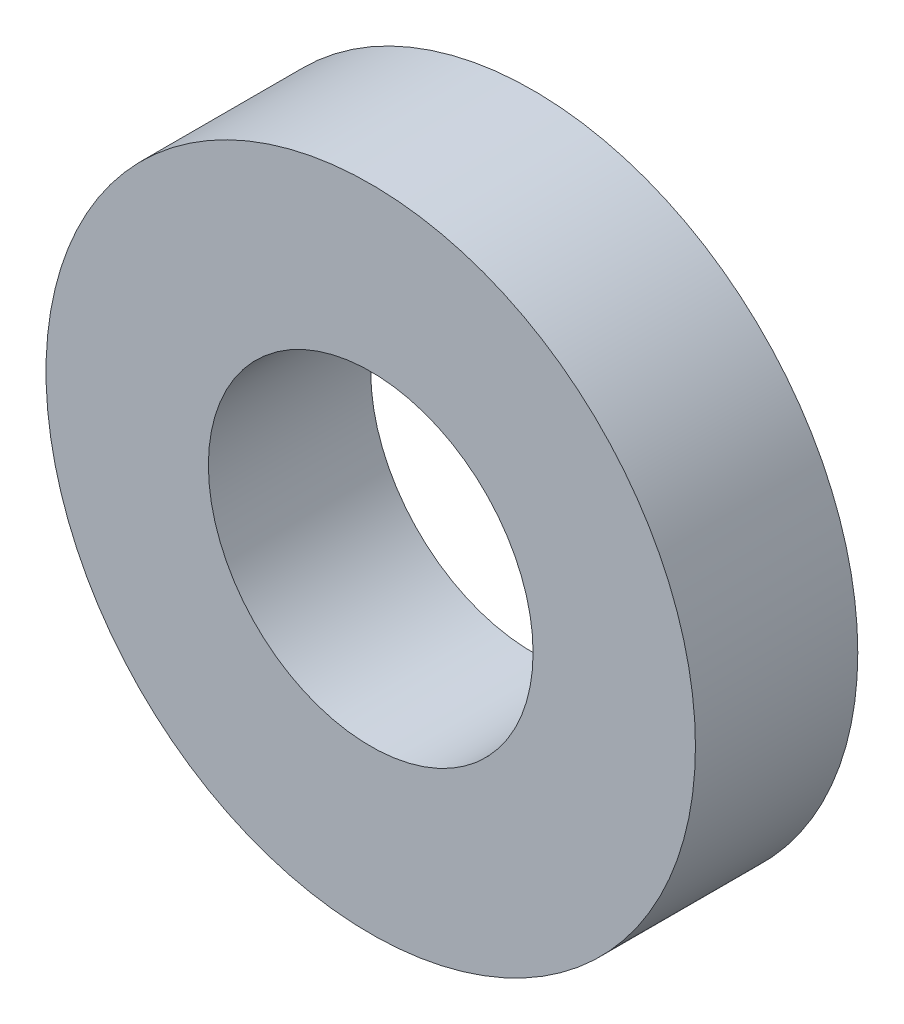
ISO-10303-21;
HEADER;
FILE_DESCRIPTION(('STEP AP214'),'2;1');
FILE_NAME('part.step','',(''),(''),'','','');
FILE_SCHEMA(('AUTOMOTIVE_DESIGN { 1 0 10303 214 1 1 1 1 }'));
ENDSEC;
DATA;
#1=APPLICATION_CONTEXT('core data for automotive mechanical design processes');
#2=APPLICATION_PROTOCOL_DEFINITION('international standard','automotive_design',2000,#1);
#3=PRODUCT_CONTEXT('',#1,'mechanical');
#4=PRODUCT('Part','Part','',(#3));
#5=PRODUCT_RELATED_PRODUCT_CATEGORY('part','',(#4));
#6=PRODUCT_DEFINITION_FORMATION('','',#4);
#7=PRODUCT_DEFINITION_CONTEXT('part definition',#1,'design');
#8=PRODUCT_DEFINITION('design','',#6,#7);
#9=PRODUCT_DEFINITION_SHAPE('','',#8);
#10=(LENGTH_UNIT() NAMED_UNIT(*) SI_UNIT(.MILLI.,.METRE.));
#11=(NAMED_UNIT(*) PLANE_ANGLE_UNIT() SI_UNIT($,.RADIAN.));
#12=(NAMED_UNIT(*) SI_UNIT($,.STERADIAN.) SOLID_ANGLE_UNIT());
#13=UNCERTAINTY_MEASURE_WITH_UNIT(LENGTH_MEASURE(1.E-05),#10,'distance_accuracy_value','');
#14=(GEOMETRIC_REPRESENTATION_CONTEXT(3) GLOBAL_UNCERTAINTY_ASSIGNED_CONTEXT((#13)) GLOBAL_UNIT_ASSIGNED_CONTEXT((#10,
#11,#12)) REPRESENTATION_CONTEXT('',''));
#15=CARTESIAN_POINT('',(0.,0.,0.));
#16=DIRECTION('',(0.,0.,1.));
#17=DIRECTION('',(1.,0.,0.));
#18=AXIS2_PLACEMENT_3D('',#15,#16,#17);
#19=CARTESIAN_POINT('',(0.,0.,2.));
#20=DIRECTION('',(0.,0.,1.));
#21=DIRECTION('',(1.,0.,0.));
#22=AXIS2_PLACEMENT_3D('',#19,#20,#21);
#23=PLANE('',#22);
#24=CARTESIAN_POINT('',(0.,0.,2.));
#25=DIRECTION('',(0.,0.,1.));
#26=DIRECTION('',(1.,0.,0.));
#27=AXIS2_PLACEMENT_3D('',#24,#25,#26);
#28=CIRCLE('',#27,4.);
#29=CARTESIAN_POINT('',(4.,0.,2.));
#30=VERTEX_POINT('',#29);
#31=EDGE_CURVE('E10',#30,#30,#28,.T.);
#32=ORIENTED_EDGE('',*,*,#31,.T.);
#33=EDGE_LOOP('',(#32));
#34=FACE_BOUND('',#33,.T.);
#35=CARTESIAN_POINT('',(0.,0.,2.));
#36=DIRECTION('',(0.,0.,1.));
#37=DIRECTION('',(1.,0.,0.));
#38=AXIS2_PLACEMENT_3D('',#35,#36,#37);
#39=CIRCLE('',#38,2.);
#40=CARTESIAN_POINT('',(2.,0.,2.));
#41=VERTEX_POINT('',#40);
#42=EDGE_CURVE('E44',#41,#41,#39,.T.);
#43=ORIENTED_EDGE('',*,*,#42,.F.);
#44=EDGE_LOOP('',(#43));
#45=FACE_BOUND('',#44,.T.);
#46=ADVANCED_FACE('F33',(#34,#45),#23,.T.);
#47=CARTESIAN_POINT('',(0.,0.,0.));
#48=DIRECTION('',(0.,0.,1.));
#49=DIRECTION('',(1.,0.,0.));
#50=AXIS2_PLACEMENT_3D('',#47,#48,#49);
#51=PLANE('',#50);
#52=CARTESIAN_POINT('',(0.,0.,0.));
#53=DIRECTION('',(0.,0.,1.));
#54=DIRECTION('',(1.,0.,0.));
#55=AXIS2_PLACEMENT_3D('',#52,#53,#54);
#56=CIRCLE('',#55,4.);
#57=CARTESIAN_POINT('',(4.,0.,0.));
#58=VERTEX_POINT('',#57);
#59=EDGE_CURVE('E37',#58,#58,#56,.T.);
#60=ORIENTED_EDGE('',*,*,#59,.F.);
#61=EDGE_LOOP('',(#60));
#62=FACE_BOUND('',#61,.T.);
#63=CARTESIAN_POINT('',(0.,0.,0.));
#64=DIRECTION('',(0.,0.,1.));
#65=DIRECTION('',(1.,0.,0.));
#66=AXIS2_PLACEMENT_3D('',#63,#64,#65);
#67=CIRCLE('',#66,2.);
#68=CARTESIAN_POINT('',(2.,0.,0.));
#69=VERTEX_POINT('',#68);
#70=EDGE_CURVE('E46',#69,#69,#67,.T.);
#71=ORIENTED_EDGE('',*,*,#70,.T.);
#72=EDGE_LOOP('',(#71));
#73=FACE_BOUND('',#72,.T.);
#74=ADVANCED_FACE('F56',(#62,#73),#51,.F.);
#75=CARTESIAN_POINT('',(0.,0.,2.));
#76=DIRECTION('',(0.,0.,-1.));
#77=DIRECTION('',(-1.,0.,0.));
#78=AXIS2_PLACEMENT_3D('',#75,#76,#77);
#79=CYLINDRICAL_SURFACE('',#78,4.);
#80=ORIENTED_EDGE('',*,*,#31,.F.);
#81=EDGE_LOOP('',(#80));
#82=FACE_BOUND('',#81,.T.);
#83=ORIENTED_EDGE('',*,*,#59,.T.);
#84=EDGE_LOOP('',(#83));
#85=FACE_BOUND('',#84,.T.);
#86=ADVANCED_FACE('F35',(#82,#85),#79,.T.);
#87=CARTESIAN_POINT('',(0.,0.,2.));
#88=DIRECTION('',(0.,0.,-1.));
#89=DIRECTION('',(-1.,0.,0.));
#90=AXIS2_PLACEMENT_3D('',#87,#88,#89);
#91=CYLINDRICAL_SURFACE('',#90,2.);
#92=ORIENTED_EDGE('',*,*,#42,.T.);
#93=EDGE_LOOP('',(#92));
#94=FACE_BOUND('',#93,.T.);
#95=ORIENTED_EDGE('',*,*,#70,.F.);
#96=EDGE_LOOP('',(#95));
#97=FACE_BOUND('',#96,.T.);
#98=ADVANCED_FACE('F52',(#94,#97),#91,.F.);
#99=CLOSED_SHELL('',(#46,#74,#86,#98));
#100=MANIFOLD_SOLID_BREP('B2',#99);
#101=ADVANCED_BREP_SHAPE_REPRESENTATION('',(#18,#100),#14);
#102=SHAPE_DEFINITION_REPRESENTATION(#9,#101);
ENDSEC;
END-ISO-10303-21;
